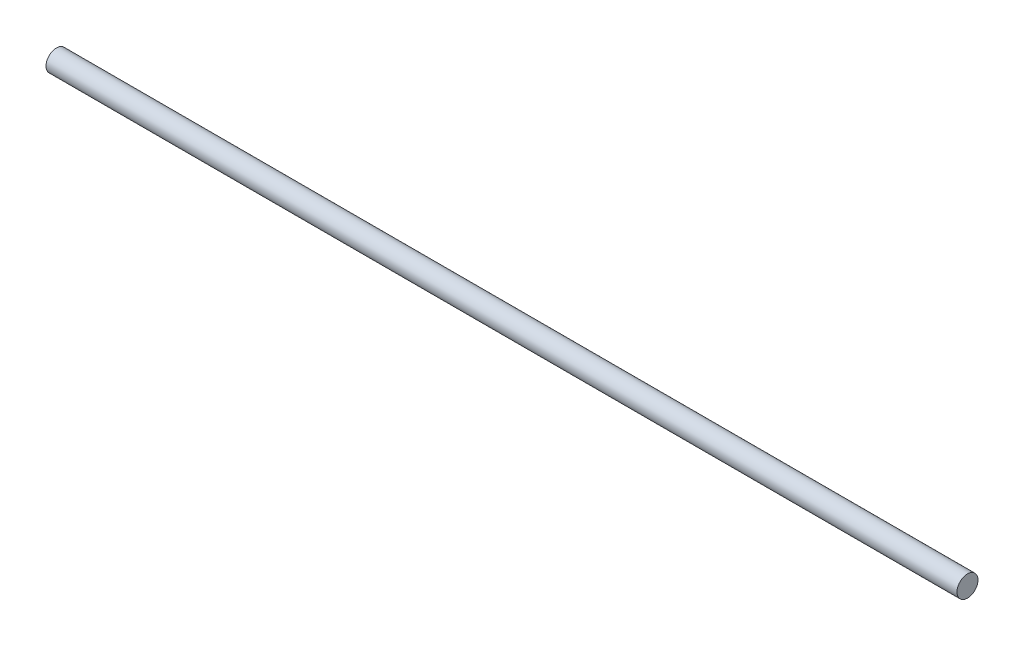
ISO-10303-21;
HEADER;
FILE_DESCRIPTION(('STEP AP214'),'2;1');
FILE_NAME('part.step','',(''),(''),'','','');
FILE_SCHEMA(('AUTOMOTIVE_DESIGN { 1 0 10303 214 1 1 1 1 }'));
ENDSEC;
DATA;
#1=APPLICATION_CONTEXT('core data for automotive mechanical design processes');
#2=APPLICATION_PROTOCOL_DEFINITION('international standard','automotive_design',2000,#1);
#3=PRODUCT_CONTEXT('',#1,'mechanical');
#4=PRODUCT('Part','Part','',(#3));
#5=PRODUCT_RELATED_PRODUCT_CATEGORY('part','',(#4));
#6=PRODUCT_DEFINITION_FORMATION('','',#4);
#7=PRODUCT_DEFINITION_CONTEXT('part definition',#1,'design');
#8=PRODUCT_DEFINITION('design','',#6,#7);
#9=PRODUCT_DEFINITION_SHAPE('','',#8);
#10=(LENGTH_UNIT() NAMED_UNIT(*) SI_UNIT(.MILLI.,.METRE.));
#11=(NAMED_UNIT(*) PLANE_ANGLE_UNIT() SI_UNIT($,.RADIAN.));
#12=(NAMED_UNIT(*) SI_UNIT($,.STERADIAN.) SOLID_ANGLE_UNIT());
#13=UNCERTAINTY_MEASURE_WITH_UNIT(LENGTH_MEASURE(1.E-05),#10,'distance_accuracy_value','');
#14=(GEOMETRIC_REPRESENTATION_CONTEXT(3) GLOBAL_UNCERTAINTY_ASSIGNED_CONTEXT((#13)) GLOBAL_UNIT_ASSIGNED_CONTEXT((#10,
#11,#12)) REPRESENTATION_CONTEXT('',''));
#15=CARTESIAN_POINT('',(0.,0.,0.));
#16=DIRECTION('',(0.,0.,1.));
#17=DIRECTION('',(1.,0.,0.));
#18=AXIS2_PLACEMENT_3D('',#15,#16,#17);
#19=CARTESIAN_POINT('',(130.,0.,0.));
#20=DIRECTION('',(-1.,0.,0.));
#21=DIRECTION('',(0.,0.,1.));
#22=AXIS2_PLACEMENT_3D('',#19,#20,#21);
#23=CYLINDRICAL_SURFACE('',#22,3.);
#24=CARTESIAN_POINT('',(130.,0.,0.));
#25=DIRECTION('',(1.,0.,0.));
#26=DIRECTION('',(0.,0.,-1.));
#27=AXIS2_PLACEMENT_3D('',#24,#25,#26);
#28=CIRCLE('',#27,3.);
#29=CARTESIAN_POINT('',(130.,0.,-3.));
#30=VERTEX_POINT('',#29);
#31=EDGE_CURVE('E10',#30,#30,#28,.T.);
#32=ORIENTED_EDGE('',*,*,#31,.F.);
#33=EDGE_LOOP('',(#32));
#34=FACE_BOUND('',#33,.T.);
#35=CARTESIAN_POINT('',(-130.,0.,0.));
#36=DIRECTION('',(1.,0.,0.));
#37=DIRECTION('',(0.,0.,-1.));
#38=AXIS2_PLACEMENT_3D('',#35,#36,#37);
#39=CIRCLE('',#38,3.);
#40=CARTESIAN_POINT('',(-130.,0.,-3.));
#41=VERTEX_POINT('',#40);
#42=EDGE_CURVE('E34',#41,#41,#39,.T.);
#43=ORIENTED_EDGE('',*,*,#42,.T.);
#44=EDGE_LOOP('',(#43));
#45=FACE_BOUND('',#44,.T.);
#46=ADVANCED_FACE('F31',(#34,#45),#23,.T.);
#47=CARTESIAN_POINT('',(130.,0.,0.));
#48=DIRECTION('',(1.,0.,0.));
#49=DIRECTION('',(0.,0.,-1.));
#50=AXIS2_PLACEMENT_3D('',#47,#48,#49);
#51=PLANE('',#50);
#52=ORIENTED_EDGE('',*,*,#31,.T.);
#53=EDGE_LOOP('',(#52));
#54=FACE_BOUND('',#53,.T.);
#55=ADVANCED_FACE('F46',(#54),#51,.T.);
#56=CARTESIAN_POINT('',(-130.,0.,0.));
#57=DIRECTION('',(1.,0.,0.));
#58=DIRECTION('',(0.,0.,-1.));
#59=AXIS2_PLACEMENT_3D('',#56,#57,#58);
#60=PLANE('',#59);
#61=ORIENTED_EDGE('',*,*,#42,.F.);
#62=EDGE_LOOP('',(#61));
#63=FACE_BOUND('',#62,.T.);
#64=ADVANCED_FACE('F44',(#63),#60,.F.);
#65=CLOSED_SHELL('',(#46,#55,#64));
#66=MANIFOLD_SOLID_BREP('B2',#65);
#67=ADVANCED_BREP_SHAPE_REPRESENTATION('',(#18,#66),#14);
#68=SHAPE_DEFINITION_REPRESENTATION(#9,#67);
ENDSEC;
END-ISO-10303-21;
